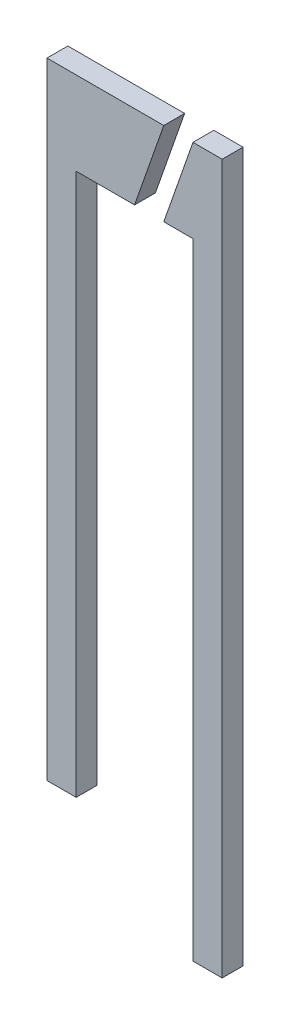
ISO-10303-21;
HEADER;
FILE_DESCRIPTION(('STEP AP214'),'2;1');
FILE_NAME('part.step','',(''),(''),'','','');
FILE_SCHEMA(('AUTOMOTIVE_DESIGN { 1 0 10303 214 1 1 1 1 }'));
ENDSEC;
DATA;
#1=APPLICATION_CONTEXT('core data for automotive mechanical design processes');
#2=APPLICATION_PROTOCOL_DEFINITION('international standard','automotive_design',2000,#1);
#3=PRODUCT_CONTEXT('',#1,'mechanical');
#4=PRODUCT('Part','Part','',(#3));
#5=PRODUCT_RELATED_PRODUCT_CATEGORY('part','',(#4));
#6=PRODUCT_DEFINITION_FORMATION('','',#4);
#7=PRODUCT_DEFINITION_CONTEXT('part definition',#1,'design');
#8=PRODUCT_DEFINITION('design','',#6,#7);
#9=PRODUCT_DEFINITION_SHAPE('','',#8);
#10=(LENGTH_UNIT() NAMED_UNIT(*) SI_UNIT(.MILLI.,.METRE.));
#11=(NAMED_UNIT(*) PLANE_ANGLE_UNIT() SI_UNIT($,.RADIAN.));
#12=(NAMED_UNIT(*) SI_UNIT($,.STERADIAN.) SOLID_ANGLE_UNIT());
#13=UNCERTAINTY_MEASURE_WITH_UNIT(LENGTH_MEASURE(1.E-05),#10,'distance_accuracy_value','');
#14=(GEOMETRIC_REPRESENTATION_CONTEXT(3) GLOBAL_UNCERTAINTY_ASSIGNED_CONTEXT((#13)) GLOBAL_UNIT_ASSIGNED_CONTEXT((#10,
#11,#12)) REPRESENTATION_CONTEXT('',''));
#15=CARTESIAN_POINT('',(0.,0.,0.));
#16=DIRECTION('',(0.,0.,1.));
#17=DIRECTION('',(1.,0.,0.));
#18=AXIS2_PLACEMENT_3D('',#15,#16,#17);
#19=CARTESIAN_POINT('',(-2.1,-15.7292622344125,0.5));
#20=DIRECTION('',(0.,-1.,0.));
#21=DIRECTION('',(1.,0.,0.));
#22=AXIS2_PLACEMENT_3D('',#19,#20,#21);
#23=PLANE('',#22);
#24=DIRECTION('',(-1.,0.,0.));
#25=VECTOR('',#24,1.);
#26=CARTESIAN_POINT('',(-2.1,-15.7292622344125,0.));
#27=LINE('',#26,#25);
#28=CARTESIAN_POINT('',(0.700000000000001,-15.7292622344125,0.));
#29=VERTEX_POINT('',#28);
#30=CARTESIAN_POINT('',(-2.1,-15.7292622344125,0.));
#31=VERTEX_POINT('',#30);
#32=EDGE_CURVE('E126',#29,#31,#27,.T.);
#33=ORIENTED_EDGE('',*,*,#32,.T.);
#34=DIRECTION('',(0.,0.,-1.));
#35=VECTOR('',#34,1.);
#36=CARTESIAN_POINT('',(-2.1,-15.7292622344125,0.5));
#37=LINE('',#36,#35);
#38=CARTESIAN_POINT('',(-2.1,-15.7292622344125,0.5));
#39=VERTEX_POINT('',#38);
#40=EDGE_CURVE('E12',#39,#31,#37,.T.);
#41=ORIENTED_EDGE('',*,*,#40,.F.);
#42=DIRECTION('',(-1.,0.,0.));
#43=VECTOR('',#42,1.);
#44=CARTESIAN_POINT('',(-2.1,-15.7292622344125,0.5));
#45=LINE('',#44,#43);
#46=CARTESIAN_POINT('',(0.700000000000001,-15.7292622344125,0.5));
#47=VERTEX_POINT('',#46);
#48=EDGE_CURVE('E136',#47,#39,#45,.T.);
#49=ORIENTED_EDGE('',*,*,#48,.F.);
#50=DIRECTION('',(0.,0.,-1.));
#51=VECTOR('',#50,1.);
#52=CARTESIAN_POINT('',(0.700000000000001,-15.7292622344125,0.5));
#53=LINE('',#52,#51);
#54=EDGE_CURVE('E122',#47,#29,#53,.T.);
#55=ORIENTED_EDGE('',*,*,#54,.T.);
#56=EDGE_LOOP('',(#33,#41,#49,#55));
#57=FACE_BOUND('',#56,.T.);
#58=ADVANCED_FACE('F42',(#57),#23,.F.);
#59=CARTESIAN_POINT('',(-2.1,-30.7292622344125,0.5));
#60=DIRECTION('',(1.,0.,0.));
#61=DIRECTION('',(0.,0.,-1.));
#62=AXIS2_PLACEMENT_3D('',#59,#60,#61);
#63=PLANE('',#62);
#64=DIRECTION('',(0.,-1.,0.));
#65=VECTOR('',#64,1.);
#66=CARTESIAN_POINT('',(-2.1,-30.7292622344125,0.));
#67=LINE('',#66,#65);
#68=CARTESIAN_POINT('',(-2.1,-30.7292622344125,0.));
#69=VERTEX_POINT('',#68);
#70=EDGE_CURVE('E129',#31,#69,#67,.T.);
#71=ORIENTED_EDGE('',*,*,#70,.T.);
#72=DIRECTION('',(0.,0.,-1.));
#73=VECTOR('',#72,1.);
#74=CARTESIAN_POINT('',(-2.1,-30.7292622344125,0.5));
#75=LINE('',#74,#73);
#76=CARTESIAN_POINT('',(-2.1,-30.7292622344125,0.5));
#77=VERTEX_POINT('',#76);
#78=EDGE_CURVE('E50',#77,#69,#75,.T.);
#79=ORIENTED_EDGE('',*,*,#78,.F.);
#80=DIRECTION('',(0.,-1.,0.));
#81=VECTOR('',#80,1.);
#82=CARTESIAN_POINT('',(-2.1,-30.7292622344125,0.5));
#83=LINE('',#82,#81);
#84=EDGE_CURVE('E95',#39,#77,#83,.T.);
#85=ORIENTED_EDGE('',*,*,#84,.F.);
#86=ORIENTED_EDGE('',*,*,#40,.T.);
#87=EDGE_LOOP('',(#71,#79,#85,#86));
#88=FACE_BOUND('',#87,.T.);
#89=ADVANCED_FACE('F160',(#88),#63,.F.);
#90=CARTESIAN_POINT('',(-1.4,-30.7292622344125,0.5));
#91=DIRECTION('',(0.,1.,0.));
#92=DIRECTION('',(0.,0.,1.));
#93=AXIS2_PLACEMENT_3D('',#90,#91,#92);
#94=PLANE('',#93);
#95=DIRECTION('',(1.,0.,0.));
#96=VECTOR('',#95,1.);
#97=CARTESIAN_POINT('',(-1.4,-30.7292622344125,0.));
#98=LINE('',#97,#96);
#99=CARTESIAN_POINT('',(-1.4,-30.7292622344125,0.));
#100=VERTEX_POINT('',#99);
#101=EDGE_CURVE('E131',#69,#100,#98,.T.);
#102=ORIENTED_EDGE('',*,*,#101,.T.);
#103=DIRECTION('',(0.,0.,-1.));
#104=VECTOR('',#103,1.);
#105=CARTESIAN_POINT('',(-1.4,-30.7292622344125,0.5));
#106=LINE('',#105,#104);
#107=CARTESIAN_POINT('',(-1.4,-30.7292622344125,0.5));
#108=VERTEX_POINT('',#107);
#109=EDGE_CURVE('E117',#108,#100,#106,.T.);
#110=ORIENTED_EDGE('',*,*,#109,.F.);
#111=DIRECTION('',(1.,0.,0.));
#112=VECTOR('',#111,1.);
#113=CARTESIAN_POINT('',(-1.4,-30.7292622344125,0.5));
#114=LINE('',#113,#112);
#115=EDGE_CURVE('E108',#77,#108,#114,.T.);
#116=ORIENTED_EDGE('',*,*,#115,.F.);
#117=ORIENTED_EDGE('',*,*,#78,.T.);
#118=EDGE_LOOP('',(#102,#110,#116,#117));
#119=FACE_BOUND('',#118,.T.);
#120=ADVANCED_FACE('F142',(#119),#94,.F.);
#121=CARTESIAN_POINT('',(-1.4,-17.7292622344125,0.5));
#122=DIRECTION('',(-1.,0.,0.));
#123=DIRECTION('',(0.,-1.,0.));
#124=AXIS2_PLACEMENT_3D('',#121,#122,#123);
#125=PLANE('',#124);
#126=DIRECTION('',(0.,1.,0.));
#127=VECTOR('',#126,1.);
#128=CARTESIAN_POINT('',(-1.4,-17.7292622344125,0.));
#129=LINE('',#128,#127);
#130=CARTESIAN_POINT('',(-1.4,-17.7292622344125,0.));
#131=VERTEX_POINT('',#130);
#132=EDGE_CURVE('E116',#100,#131,#129,.T.);
#133=ORIENTED_EDGE('',*,*,#132,.T.);
#134=DIRECTION('',(0.,0.,-1.));
#135=VECTOR('',#134,1.);
#136=CARTESIAN_POINT('',(-1.4,-17.7292622344125,0.5));
#137=LINE('',#136,#135);
#138=CARTESIAN_POINT('',(-1.4,-17.7292622344125,0.5));
#139=VERTEX_POINT('',#138);
#140=EDGE_CURVE('E113',#139,#131,#137,.T.);
#141=ORIENTED_EDGE('',*,*,#140,.F.);
#142=DIRECTION('',(0.,1.,0.));
#143=VECTOR('',#142,1.);
#144=CARTESIAN_POINT('',(-1.4,-17.7292622344125,0.5));
#145=LINE('',#144,#143);
#146=EDGE_CURVE('E102',#108,#139,#145,.T.);
#147=ORIENTED_EDGE('',*,*,#146,.F.);
#148=ORIENTED_EDGE('',*,*,#109,.T.);
#149=EDGE_LOOP('',(#133,#141,#147,#148));
#150=FACE_BOUND('',#149,.T.);
#151=ADVANCED_FACE('F114',(#150),#125,.F.);
#152=CARTESIAN_POINT('',(0.,-17.7292622344125,0.5));
#153=DIRECTION('',(0.,1.,0.));
#154=DIRECTION('',(0.,0.,1.));
#155=AXIS2_PLACEMENT_3D('',#152,#153,#154);
#156=PLANE('',#155);
#157=DIRECTION('',(1.,0.,0.));
#158=VECTOR('',#157,1.);
#159=CARTESIAN_POINT('',(0.,-17.7292622344125,0.));
#160=LINE('',#159,#158);
#161=CARTESIAN_POINT('',(0.,-17.7292622344125,0.));
#162=VERTEX_POINT('',#161);
#163=EDGE_CURVE('E81',#131,#162,#160,.T.);
#164=ORIENTED_EDGE('',*,*,#163,.T.);
#165=DIRECTION('',(0.,0.,-1.));
#166=VECTOR('',#165,1.);
#167=CARTESIAN_POINT('',(0.,-17.7292622344125,0.5));
#168=LINE('',#167,#166);
#169=CARTESIAN_POINT('',(0.,-17.7292622344125,0.5));
#170=VERTEX_POINT('',#169);
#171=EDGE_CURVE('E118',#170,#162,#168,.T.);
#172=ORIENTED_EDGE('',*,*,#171,.F.);
#173=DIRECTION('',(1.,0.,0.));
#174=VECTOR('',#173,1.);
#175=CARTESIAN_POINT('',(0.,-17.7292622344125,0.5));
#176=LINE('',#175,#174);
#177=EDGE_CURVE('E106',#139,#170,#176,.T.);
#178=ORIENTED_EDGE('',*,*,#177,.F.);
#179=ORIENTED_EDGE('',*,*,#140,.T.);
#180=EDGE_LOOP('',(#164,#172,#178,#179));
#181=FACE_BOUND('',#180,.T.);
#182=ADVANCED_FACE('F120',(#181),#156,.F.);
#183=CARTESIAN_POINT('',(0.700000000000001,-15.7292622344125,0.5));
#184=DIRECTION('',(-0.943858356366017,0.330350424728107,0.));
#185=DIRECTION('',(-0.330350424728107,-0.943858356366017,0.));
#186=AXIS2_PLACEMENT_3D('',#183,#184,#185);
#187=PLANE('',#186);
#188=DIRECTION('',(0.330350424728106,0.943858356366017,0.));
#189=VECTOR('',#188,1.);
#190=CARTESIAN_POINT('',(0.700000000000001,-15.7292622344125,0.));
#191=LINE('',#190,#189);
#192=EDGE_CURVE('E87',#162,#29,#191,.T.);
#193=ORIENTED_EDGE('',*,*,#192,.T.);
#194=ORIENTED_EDGE('',*,*,#54,.F.);
#195=DIRECTION('',(0.330350424728106,0.943858356366017,0.));
#196=VECTOR('',#195,1.);
#197=CARTESIAN_POINT('',(0.700000000000001,-15.7292622344125,0.5));
#198=LINE('',#197,#196);
#199=EDGE_CURVE('E58',#170,#47,#198,.T.);
#200=ORIENTED_EDGE('',*,*,#199,.F.);
#201=ORIENTED_EDGE('',*,*,#171,.T.);
#202=EDGE_LOOP('',(#193,#194,#200,#201));
#203=FACE_BOUND('',#202,.T.);
#204=ADVANCED_FACE('F149',(#203),#187,.F.);
#205=CARTESIAN_POINT('',(-1.4,-15.7292622344125,0.5));
#206=DIRECTION('',(0.,0.,-1.));
#207=DIRECTION('',(-1.,0.,0.));
#208=AXIS2_PLACEMENT_3D('',#205,#206,#207);
#209=PLANE('',#208);
#210=ORIENTED_EDGE('',*,*,#48,.T.);
#211=ORIENTED_EDGE('',*,*,#84,.T.);
#212=ORIENTED_EDGE('',*,*,#115,.T.);
#213=ORIENTED_EDGE('',*,*,#146,.T.);
#214=ORIENTED_EDGE('',*,*,#177,.T.);
#215=ORIENTED_EDGE('',*,*,#199,.T.);
#216=EDGE_LOOP('',(#210,#211,#212,#213,#214,#215));
#217=FACE_BOUND('',#216,.T.);
#218=ADVANCED_FACE('F104',(#217),#209,.F.);
#219=CARTESIAN_POINT('',(-1.4,-15.7292622344125,0.));
#220=DIRECTION('',(0.,0.,-1.));
#221=DIRECTION('',(-1.,0.,0.));
#222=AXIS2_PLACEMENT_3D('',#219,#220,#221);
#223=PLANE('',#222);
#224=ORIENTED_EDGE('',*,*,#32,.F.);
#225=ORIENTED_EDGE('',*,*,#192,.F.);
#226=ORIENTED_EDGE('',*,*,#163,.F.);
#227=ORIENTED_EDGE('',*,*,#132,.F.);
#228=ORIENTED_EDGE('',*,*,#101,.F.);
#229=ORIENTED_EDGE('',*,*,#70,.F.);
#230=EDGE_LOOP('',(#224,#225,#226,#227,#228,#229));
#231=FACE_BOUND('',#230,.T.);
#232=ADVANCED_FACE('F145',(#231),#223,.T.);
#233=CLOSED_SHELL('',(#58,#89,#120,#151,#182,#204,#218,#232));
#234=MANIFOLD_SOLID_BREP('B2',#233);
#235=CARTESIAN_POINT('',(1.4,-15.7292622344125,0.5));
#236=DIRECTION('',(0.943858356366018,-0.330350424728106,0.));
#237=DIRECTION('',(0.330350424728106,0.943858356366018,0.));
#238=AXIS2_PLACEMENT_3D('',#235,#236,#237);
#239=PLANE('',#238);
#240=DIRECTION('',(-0.330350424728106,-0.943858356366018,0.));
#241=VECTOR('',#240,1.);
#242=CARTESIAN_POINT('',(1.4,-15.7292622344125,0.));
#243=LINE('',#242,#241);
#244=CARTESIAN_POINT('',(1.4,-15.7292622344125,0.));
#245=VERTEX_POINT('',#244);
#246=CARTESIAN_POINT('',(0.700000000000002,-17.7292622344125,0.));
#247=VERTEX_POINT('',#246);
#248=EDGE_CURVE('E301',#245,#247,#243,.T.);
#249=ORIENTED_EDGE('',*,*,#248,.T.);
#250=DIRECTION('',(0.,0.,-1.));
#251=VECTOR('',#250,1.);
#252=CARTESIAN_POINT('',(0.700000000000002,-17.7292622344125,0.5));
#253=LINE('',#252,#251);
#254=CARTESIAN_POINT('',(0.700000000000002,-17.7292622344125,0.5));
#255=VERTEX_POINT('',#254);
#256=EDGE_CURVE('E40',#255,#247,#253,.T.);
#257=ORIENTED_EDGE('',*,*,#256,.F.);
#258=DIRECTION('',(-0.330350424728106,-0.943858356366018,0.));
#259=VECTOR('',#258,1.);
#260=CARTESIAN_POINT('',(1.4,-15.7292622344125,0.5));
#261=LINE('',#260,#259);
#262=CARTESIAN_POINT('',(1.4,-15.7292622344125,0.5));
#263=VERTEX_POINT('',#262);
#264=EDGE_CURVE('E311',#263,#255,#261,.T.);
#265=ORIENTED_EDGE('',*,*,#264,.F.);
#266=DIRECTION('',(0.,0.,-1.));
#267=VECTOR('',#266,1.);
#268=CARTESIAN_POINT('',(1.4,-15.7292622344125,0.5));
#269=LINE('',#268,#267);
#270=EDGE_CURVE('E297',#263,#245,#269,.T.);
#271=ORIENTED_EDGE('',*,*,#270,.T.);
#272=EDGE_LOOP('',(#249,#257,#265,#271));
#273=FACE_BOUND('',#272,.T.);
#274=ADVANCED_FACE('F217',(#273),#239,.F.);
#275=CARTESIAN_POINT('',(0.700000000000002,-17.7292622344125,0.5));
#276=DIRECTION('',(0.,1.,0.));
#277=DIRECTION('',(-1.,0.,0.));
#278=AXIS2_PLACEMENT_3D('',#275,#276,#277);
#279=PLANE('',#278);
#280=DIRECTION('',(1.,0.,0.));
#281=VECTOR('',#280,1.);
#282=CARTESIAN_POINT('',(0.700000000000002,-17.7292622344125,0.));
#283=LINE('',#282,#281);
#284=CARTESIAN_POINT('',(1.4,-17.7292622344125,0.));
#285=VERTEX_POINT('',#284);
#286=EDGE_CURVE('E304',#247,#285,#283,.T.);
#287=ORIENTED_EDGE('',*,*,#286,.T.);
#288=DIRECTION('',(0.,0.,-1.));
#289=VECTOR('',#288,1.);
#290=CARTESIAN_POINT('',(1.4,-17.7292622344125,0.5));
#291=LINE('',#290,#289);
#292=CARTESIAN_POINT('',(1.4,-17.7292622344125,0.5));
#293=VERTEX_POINT('',#292);
#294=EDGE_CURVE('E225',#293,#285,#291,.T.);
#295=ORIENTED_EDGE('',*,*,#294,.F.);
#296=DIRECTION('',(1.,0.,0.));
#297=VECTOR('',#296,1.);
#298=CARTESIAN_POINT('',(0.700000000000002,-17.7292622344125,0.5));
#299=LINE('',#298,#297);
#300=EDGE_CURVE('E270',#255,#293,#299,.T.);
#301=ORIENTED_EDGE('',*,*,#300,.F.);
#302=ORIENTED_EDGE('',*,*,#256,.T.);
#303=EDGE_LOOP('',(#287,#295,#301,#302));
#304=FACE_BOUND('',#303,.T.);
#305=ADVANCED_FACE('F335',(#304),#279,.F.);
#306=CARTESIAN_POINT('',(1.4,-17.7292622344125,0.5));
#307=DIRECTION('',(1.,0.,0.));
#308=DIRECTION('',(0.,1.,0.));
#309=AXIS2_PLACEMENT_3D('',#306,#307,#308);
#310=PLANE('',#309);
#311=DIRECTION('',(0.,-1.,0.));
#312=VECTOR('',#311,1.);
#313=CARTESIAN_POINT('',(1.4,-17.7292622344125,0.));
#314=LINE('',#313,#312);
#315=CARTESIAN_POINT('',(1.4,-32.7292622344125,0.));
#316=VERTEX_POINT('',#315);
#317=EDGE_CURVE('E306',#285,#316,#314,.T.);
#318=ORIENTED_EDGE('',*,*,#317,.T.);
#319=DIRECTION('',(0.,0.,-1.));
#320=VECTOR('',#319,1.);
#321=CARTESIAN_POINT('',(1.4,-32.7292622344125,0.5));
#322=LINE('',#321,#320);
#323=CARTESIAN_POINT('',(1.4,-32.7292622344125,0.5));
#324=VERTEX_POINT('',#323);
#325=EDGE_CURVE('E292',#324,#316,#322,.T.);
#326=ORIENTED_EDGE('',*,*,#325,.F.);
#327=DIRECTION('',(0.,-1.,0.));
#328=VECTOR('',#327,1.);
#329=CARTESIAN_POINT('',(1.4,-17.7292622344125,0.5));
#330=LINE('',#329,#328);
#331=EDGE_CURVE('E283',#293,#324,#330,.T.);
#332=ORIENTED_EDGE('',*,*,#331,.F.);
#333=ORIENTED_EDGE('',*,*,#294,.T.);
#334=EDGE_LOOP('',(#318,#326,#332,#333));
#335=FACE_BOUND('',#334,.T.);
#336=ADVANCED_FACE('F317',(#335),#310,.F.);
#337=CARTESIAN_POINT('',(1.4,-32.7292622344125,0.5));
#338=DIRECTION('',(0.,1.,0.));
#339=DIRECTION('',(-1.,0.,0.));
#340=AXIS2_PLACEMENT_3D('',#337,#338,#339);
#341=PLANE('',#340);
#342=DIRECTION('',(1.,0.,0.));
#343=VECTOR('',#342,1.);
#344=CARTESIAN_POINT('',(1.4,-32.7292622344125,0.));
#345=LINE('',#344,#343);
#346=CARTESIAN_POINT('',(2.1,-32.7292622344125,0.));
#347=VERTEX_POINT('',#346);
#348=EDGE_CURVE('E291',#316,#347,#345,.T.);
#349=ORIENTED_EDGE('',*,*,#348,.T.);
#350=DIRECTION('',(0.,0.,-1.));
#351=VECTOR('',#350,1.);
#352=CARTESIAN_POINT('',(2.1,-32.7292622344125,0.5));
#353=LINE('',#352,#351);
#354=CARTESIAN_POINT('',(2.1,-32.7292622344125,0.5));
#355=VERTEX_POINT('',#354);
#356=EDGE_CURVE('E288',#355,#347,#353,.T.);
#357=ORIENTED_EDGE('',*,*,#356,.F.);
#358=DIRECTION('',(1.,0.,0.));
#359=VECTOR('',#358,1.);
#360=CARTESIAN_POINT('',(1.4,-32.7292622344125,0.5));
#361=LINE('',#360,#359);
#362=EDGE_CURVE('E277',#324,#355,#361,.T.);
#363=ORIENTED_EDGE('',*,*,#362,.F.);
#364=ORIENTED_EDGE('',*,*,#325,.T.);
#365=EDGE_LOOP('',(#349,#357,#363,#364));
#366=FACE_BOUND('',#365,.T.);
#367=ADVANCED_FACE('F289',(#366),#341,.F.);
#368=CARTESIAN_POINT('',(2.1,-15.7292622344125,0.5));
#369=DIRECTION('',(-1.,0.,0.));
#370=DIRECTION('',(0.,-1.,0.));
#371=AXIS2_PLACEMENT_3D('',#368,#369,#370);
#372=PLANE('',#371);
#373=DIRECTION('',(0.,1.,0.));
#374=VECTOR('',#373,1.);
#375=CARTESIAN_POINT('',(2.1,-15.7292622344125,0.));
#376=LINE('',#375,#374);
#377=CARTESIAN_POINT('',(2.1,-15.7292622344125,0.));
#378=VERTEX_POINT('',#377);
#379=EDGE_CURVE('E256',#347,#378,#376,.T.);
#380=ORIENTED_EDGE('',*,*,#379,.T.);
#381=DIRECTION('',(0.,0.,-1.));
#382=VECTOR('',#381,1.);
#383=CARTESIAN_POINT('',(2.1,-15.7292622344125,0.5));
#384=LINE('',#383,#382);
#385=CARTESIAN_POINT('',(2.1,-15.7292622344125,0.5));
#386=VERTEX_POINT('',#385);
#387=EDGE_CURVE('E293',#386,#378,#384,.T.);
#388=ORIENTED_EDGE('',*,*,#387,.F.);
#389=DIRECTION('',(0.,1.,0.));
#390=VECTOR('',#389,1.);
#391=CARTESIAN_POINT('',(2.1,-15.7292622344125,0.5));
#392=LINE('',#391,#390);
#393=EDGE_CURVE('E281',#355,#386,#392,.T.);
#394=ORIENTED_EDGE('',*,*,#393,.F.);
#395=ORIENTED_EDGE('',*,*,#356,.T.);
#396=EDGE_LOOP('',(#380,#388,#394,#395));
#397=FACE_BOUND('',#396,.T.);
#398=ADVANCED_FACE('F295',(#397),#372,.F.);
#399=CARTESIAN_POINT('',(1.4,-15.7292622344125,0.5));
#400=DIRECTION('',(0.,-1.,0.));
#401=DIRECTION('',(1.,0.,0.));
#402=AXIS2_PLACEMENT_3D('',#399,#400,#401);
#403=PLANE('',#402);
#404=DIRECTION('',(-1.,0.,0.));
#405=VECTOR('',#404,1.);
#406=CARTESIAN_POINT('',(1.4,-15.7292622344125,0.));
#407=LINE('',#406,#405);
#408=EDGE_CURVE('E262',#378,#245,#407,.T.);
#409=ORIENTED_EDGE('',*,*,#408,.T.);
#410=ORIENTED_EDGE('',*,*,#270,.F.);
#411=DIRECTION('',(-1.,0.,0.));
#412=VECTOR('',#411,1.);
#413=CARTESIAN_POINT('',(1.4,-15.7292622344125,0.5));
#414=LINE('',#413,#412);
#415=EDGE_CURVE('E233',#386,#263,#414,.T.);
#416=ORIENTED_EDGE('',*,*,#415,.F.);
#417=ORIENTED_EDGE('',*,*,#387,.T.);
#418=EDGE_LOOP('',(#409,#410,#416,#417));
#419=FACE_BOUND('',#418,.T.);
#420=ADVANCED_FACE('F324',(#419),#403,.F.);
#421=CARTESIAN_POINT('',(0.700000000000002,-17.7292622344125,0.5));
#422=DIRECTION('',(0.,0.,1.));
#423=DIRECTION('',(1.,0.,0.));
#424=AXIS2_PLACEMENT_3D('',#421,#422,#423);
#425=PLANE('',#424);
#426=ORIENTED_EDGE('',*,*,#264,.T.);
#427=ORIENTED_EDGE('',*,*,#300,.T.);
#428=ORIENTED_EDGE('',*,*,#331,.T.);
#429=ORIENTED_EDGE('',*,*,#362,.T.);
#430=ORIENTED_EDGE('',*,*,#393,.T.);
#431=ORIENTED_EDGE('',*,*,#415,.T.);
#432=EDGE_LOOP('',(#426,#427,#428,#429,#430,#431));
#433=FACE_BOUND('',#432,.T.);
#434=ADVANCED_FACE('F279',(#433),#425,.T.);
#435=CARTESIAN_POINT('',(0.700000000000002,-17.7292622344125,0.));
#436=DIRECTION('',(0.,0.,1.));
#437=DIRECTION('',(1.,0.,0.));
#438=AXIS2_PLACEMENT_3D('',#435,#436,#437);
#439=PLANE('',#438);
#440=ORIENTED_EDGE('',*,*,#248,.F.);
#441=ORIENTED_EDGE('',*,*,#408,.F.);
#442=ORIENTED_EDGE('',*,*,#379,.F.);
#443=ORIENTED_EDGE('',*,*,#348,.F.);
#444=ORIENTED_EDGE('',*,*,#317,.F.);
#445=ORIENTED_EDGE('',*,*,#286,.F.);
#446=EDGE_LOOP('',(#440,#441,#442,#443,#444,#445));
#447=FACE_BOUND('',#446,.T.);
#448=ADVANCED_FACE('F320',(#447),#439,.F.);
#449=CLOSED_SHELL('',(#274,#305,#336,#367,#398,#420,#434,#448));
#450=MANIFOLD_SOLID_BREP('B6',#449);
#451=ADVANCED_BREP_SHAPE_REPRESENTATION('',(#18,#234,#450),#14);
#452=SHAPE_DEFINITION_REPRESENTATION(#9,#451);
ENDSEC;
END-ISO-10303-21;
